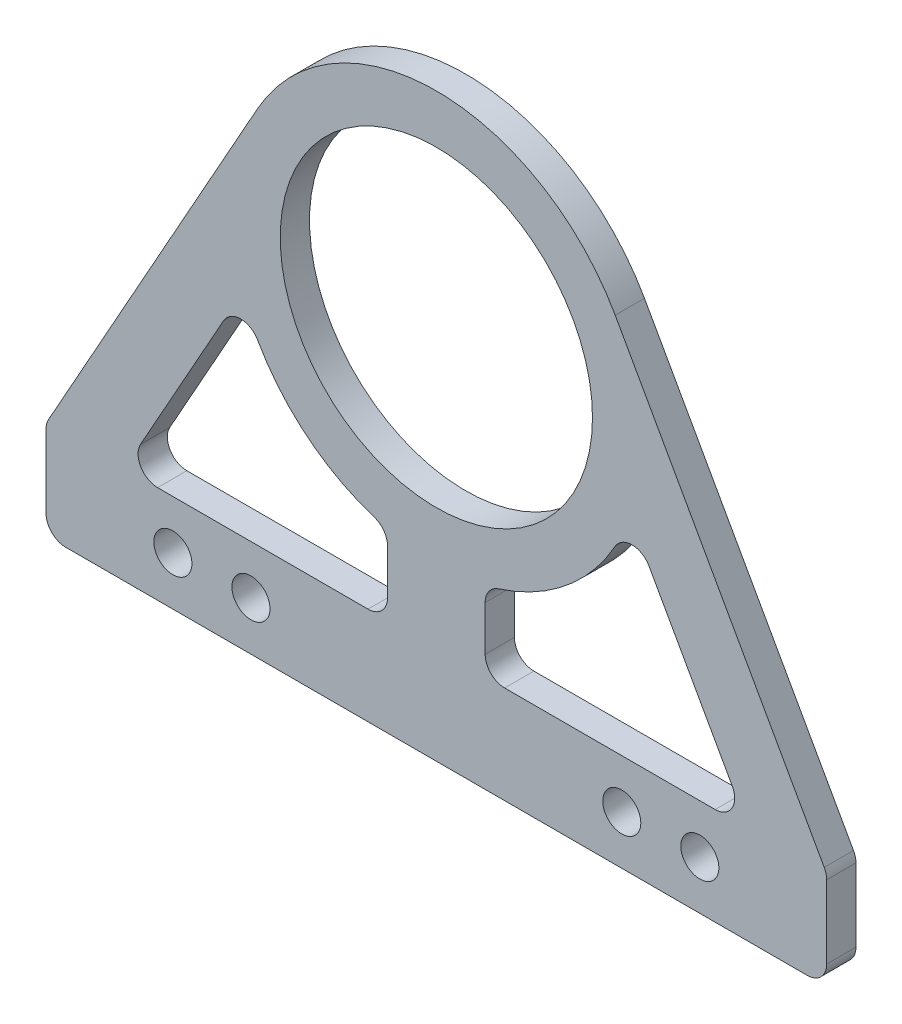
ISO-10303-21;
HEADER;
FILE_DESCRIPTION(('STEP AP214'),'2;1');
FILE_NAME('part.step','',(''),(''),'','','');
FILE_SCHEMA(('AUTOMOTIVE_DESIGN { 1 0 10303 214 1 1 1 1 }'));
ENDSEC;
DATA;
#1=APPLICATION_CONTEXT('core data for automotive mechanical design processes');
#2=APPLICATION_PROTOCOL_DEFINITION('international standard','automotive_design',2000,#1);
#3=PRODUCT_CONTEXT('',#1,'mechanical');
#4=PRODUCT('Part','Part','',(#3));
#5=PRODUCT_RELATED_PRODUCT_CATEGORY('part','',(#4));
#6=PRODUCT_DEFINITION_FORMATION('','',#4);
#7=PRODUCT_DEFINITION_CONTEXT('part definition',#1,'design');
#8=PRODUCT_DEFINITION('design','',#6,#7);
#9=PRODUCT_DEFINITION_SHAPE('','',#8);
#10=(LENGTH_UNIT() NAMED_UNIT(*) SI_UNIT(.MILLI.,.METRE.));
#11=(NAMED_UNIT(*) PLANE_ANGLE_UNIT() SI_UNIT($,.RADIAN.));
#12=(NAMED_UNIT(*) SI_UNIT($,.STERADIAN.) SOLID_ANGLE_UNIT());
#13=UNCERTAINTY_MEASURE_WITH_UNIT(LENGTH_MEASURE(1.E-05),#10,'distance_accuracy_value','');
#14=(GEOMETRIC_REPRESENTATION_CONTEXT(3) GLOBAL_UNCERTAINTY_ASSIGNED_CONTEXT((#13)) GLOBAL_UNIT_ASSIGNED_CONTEXT((#10,
#11,#12)) REPRESENTATION_CONTEXT('',''));
#15=CARTESIAN_POINT('',(0.,0.,0.));
#16=DIRECTION('',(0.,0.,1.));
#17=DIRECTION('',(1.,0.,0.));
#18=AXIS2_PLACEMENT_3D('',#15,#16,#17);
#19=CARTESIAN_POINT('',(0.,0.,3.));
#20=DIRECTION('',(0.,0.,1.));
#21=DIRECTION('',(1.,0.,0.));
#22=AXIS2_PLACEMENT_3D('',#19,#20,#21);
#23=PLANE('',#22);
#24=CARTESIAN_POINT('',(0.,0.,3.));
#25=DIRECTION('',(0.,0.,-1.));
#26=DIRECTION('',(-1.,0.,0.));
#27=AXIS2_PLACEMENT_3D('',#24,#25,#26);
#28=CIRCLE('',#27,21.);
#29=CARTESIAN_POINT('',(18.307282516346,-10.2880224954406,3.));
#30=VERTEX_POINT('',#29);
#31=CARTESIAN_POINT('',(6.39130434782609,-20.0037803610582,3.));
#32=VERTEX_POINT('',#31);
#33=EDGE_CURVE('E375',#30,#32,#28,.T.);
#34=ORIENTED_EDGE('',*,*,#33,.F.);
#35=CARTESIAN_POINT('',(20.0508332321885,-11.2678341616731,3.));
#36=DIRECTION('',(0.,0.,1.));
#37=DIRECTION('',(1.,0.,0.));
#38=AXIS2_PLACEMENT_3D('',#35,#36,#37);
#39=CIRCLE('',#38,2.);
#40=CARTESIAN_POINT('',(21.7963941777401,-10.2916082731796,3.));
#41=VERTEX_POINT('',#40);
#42=EDGE_CURVE('E352',#30,#41,#39,.F.);
#43=ORIENTED_EDGE('',*,*,#42,.T.);
#44=DIRECTION('',(-0.488112944246752,0.87278047277581,0.));
#45=VECTOR('',#44,1.);
#46=CARTESIAN_POINT('',(19.8591026870945,-6.82759404647329,3.));
#47=LINE('',#46,#45);
#48=CARTESIAN_POINT('',(30.3151655601406,-25.5237741115065,3.));
#49=VERTEX_POINT('',#48);
#50=EDGE_CURVE('E793',#49,#41,#47,.T.);
#51=ORIENTED_EDGE('',*,*,#50,.F.);
#52=CARTESIAN_POINT('',(28.569604614589,-26.5,3.));
#53=DIRECTION('',(0.,0.,1.));
#54=DIRECTION('',(1.,0.,0.));
#55=AXIS2_PLACEMENT_3D('',#52,#53,#54);
#56=CIRCLE('',#55,2.);
#57=CARTESIAN_POINT('',(28.569604614589,-28.5,3.));
#58=VERTEX_POINT('',#57);
#59=EDGE_CURVE('E340',#49,#58,#56,.F.);
#60=ORIENTED_EDGE('',*,*,#59,.T.);
#61=DIRECTION('',(1.,0.,0.));
#62=VECTOR('',#61,1.);
#63=CARTESIAN_POINT('',(31.9796555739417,-28.5,3.));
#64=LINE('',#63,#62);
#65=CARTESIAN_POINT('',(7.,-28.5,3.));
#66=VERTEX_POINT('',#65);
#67=EDGE_CURVE('E797',#66,#58,#64,.T.);
#68=ORIENTED_EDGE('',*,*,#67,.F.);
#69=CARTESIAN_POINT('',(7.,-26.5,3.));
#70=DIRECTION('',(0.,0.,1.));
#71=DIRECTION('',(1.,0.,0.));
#72=AXIS2_PLACEMENT_3D('',#69,#70,#71);
#73=CIRCLE('',#72,2.);
#74=CARTESIAN_POINT('',(5.,-26.5,3.));
#75=VERTEX_POINT('',#74);
#76=EDGE_CURVE('E344',#66,#75,#73,.F.);
#77=ORIENTED_EDGE('',*,*,#76,.T.);
#78=DIRECTION('',(0.,-1.,0.));
#79=VECTOR('',#78,1.);
#80=CARTESIAN_POINT('',(5.,-20.3960780543711,3.));
#81=LINE('',#80,#79);
#82=CARTESIAN_POINT('',(5.,-21.9089023002066,3.));
#83=VERTEX_POINT('',#82);
#84=EDGE_CURVE('E800',#83,#75,#81,.T.);
#85=ORIENTED_EDGE('',*,*,#84,.F.);
#86=CARTESIAN_POINT('',(7.,-21.9089023002066,3.));
#87=DIRECTION('',(0.,0.,1.));
#88=DIRECTION('',(1.,0.,0.));
#89=AXIS2_PLACEMENT_3D('',#86,#87,#88);
#90=CIRCLE('',#89,2.);
#91=EDGE_CURVE('E348',#83,#32,#90,.F.);
#92=ORIENTED_EDGE('',*,*,#91,.T.);
#93=EDGE_LOOP('',(#34,#43,#51,#60,#68,#77,#85,#92));
#94=FACE_BOUND('',#93,.T.);
#95=DIRECTION('',(-0.488112944246752,-0.872780472775811,0.));
#96=VECTOR('',#95,1.);
#97=CARTESIAN_POINT('',(-19.8591026870945,-6.82759404647329,3.));
#98=LINE('',#97,#96);
#99=CARTESIAN_POINT('',(-21.7963941777401,-10.2916082731796,3.));
#100=VERTEX_POINT('',#99);
#101=CARTESIAN_POINT('',(-30.3151655601406,-25.5237741115065,3.));
#102=VERTEX_POINT('',#101);
#103=EDGE_CURVE('E364',#100,#102,#98,.T.);
#104=ORIENTED_EDGE('',*,*,#103,.F.);
#105=CARTESIAN_POINT('',(-20.0508332321885,-11.2678341616731,3.));
#106=DIRECTION('',(0.,0.,1.));
#107=DIRECTION('',(1.,0.,0.));
#108=AXIS2_PLACEMENT_3D('',#105,#106,#107);
#109=CIRCLE('',#108,2.);
#110=CARTESIAN_POINT('',(-18.307282516346,-10.2880224954406,3.));
#111=VERTEX_POINT('',#110);
#112=EDGE_CURVE('E356',#100,#111,#109,.F.);
#113=ORIENTED_EDGE('',*,*,#112,.T.);
#114=CARTESIAN_POINT('',(0.,0.,3.));
#115=DIRECTION('',(0.,0.,-1.));
#116=DIRECTION('',(1.,0.,0.));
#117=AXIS2_PLACEMENT_3D('',#114,#115,#116);
#118=CIRCLE('',#117,21.);
#119=CARTESIAN_POINT('',(-6.39130434782608,-20.0037803610582,3.));
#120=VERTEX_POINT('',#119);
#121=EDGE_CURVE('E392',#120,#111,#118,.T.);
#122=ORIENTED_EDGE('',*,*,#121,.F.);
#123=CARTESIAN_POINT('',(-7.,-21.9089023002066,3.));
#124=DIRECTION('',(0.,0.,1.));
#125=DIRECTION('',(1.,0.,0.));
#126=AXIS2_PLACEMENT_3D('',#123,#124,#125);
#127=CIRCLE('',#126,2.);
#128=CARTESIAN_POINT('',(-5.,-21.9089023002066,3.));
#129=VERTEX_POINT('',#128);
#130=EDGE_CURVE('E332',#120,#129,#127,.F.);
#131=ORIENTED_EDGE('',*,*,#130,.T.);
#132=DIRECTION('',(0.,1.,0.));
#133=VECTOR('',#132,1.);
#134=CARTESIAN_POINT('',(-5.,-20.3960780543711,3.));
#135=LINE('',#134,#133);
#136=CARTESIAN_POINT('',(-5.,-26.5,3.));
#137=VERTEX_POINT('',#136);
#138=EDGE_CURVE('E788',#137,#129,#135,.T.);
#139=ORIENTED_EDGE('',*,*,#138,.F.);
#140=CARTESIAN_POINT('',(-7.,-26.5,3.));
#141=DIRECTION('',(0.,0.,1.));
#142=DIRECTION('',(1.,0.,0.));
#143=AXIS2_PLACEMENT_3D('',#140,#141,#142);
#144=CIRCLE('',#143,2.);
#145=CARTESIAN_POINT('',(-7.,-28.5,3.));
#146=VERTEX_POINT('',#145);
#147=EDGE_CURVE('E336',#137,#146,#144,.F.);
#148=ORIENTED_EDGE('',*,*,#147,.T.);
#149=DIRECTION('',(1.,0.,0.));
#150=VECTOR('',#149,1.);
#151=CARTESIAN_POINT('',(-31.9796555739417,-28.5,3.));
#152=LINE('',#151,#150);
#153=CARTESIAN_POINT('',(-28.569604614589,-28.5,3.));
#154=VERTEX_POINT('',#153);
#155=EDGE_CURVE('E366',#154,#146,#152,.T.);
#156=ORIENTED_EDGE('',*,*,#155,.F.);
#157=CARTESIAN_POINT('',(-28.569604614589,-26.5,3.));
#158=DIRECTION('',(0.,0.,1.));
#159=DIRECTION('',(1.,0.,0.));
#160=AXIS2_PLACEMENT_3D('',#157,#158,#159);
#161=CIRCLE('',#160,2.);
#162=EDGE_CURVE('E49',#154,#102,#161,.F.);
#163=ORIENTED_EDGE('',*,*,#162,.T.);
#164=EDGE_LOOP('',(#104,#113,#122,#131,#139,#148,#156,#163));
#165=FACE_BOUND('',#164,.T.);
#166=CARTESIAN_POINT('',(-27.,-33.5,3.));
#167=DIRECTION('',(0.,0.,1.));
#168=DIRECTION('',(1.,0.,0.));
#169=AXIS2_PLACEMENT_3D('',#166,#167,#168);
#170=CIRCLE('',#169,1.95);
#171=CARTESIAN_POINT('',(-25.05,-33.5,3.));
#172=VERTEX_POINT('',#171);
#173=EDGE_CURVE('E406',#172,#172,#170,.T.);
#174=ORIENTED_EDGE('',*,*,#173,.F.);
#175=EDGE_LOOP('',(#174));
#176=FACE_BOUND('',#175,.T.);
#177=CARTESIAN_POINT('',(27.,-33.5,3.));
#178=DIRECTION('',(0.,0.,1.));
#179=DIRECTION('',(1.,0.,0.));
#180=AXIS2_PLACEMENT_3D('',#177,#178,#179);
#181=CIRCLE('',#180,1.95);
#182=CARTESIAN_POINT('',(28.95,-33.5,3.));
#183=VERTEX_POINT('',#182);
#184=EDGE_CURVE('E418',#183,#183,#181,.T.);
#185=ORIENTED_EDGE('',*,*,#184,.F.);
#186=EDGE_LOOP('',(#185));
#187=FACE_BOUND('',#186,.T.);
#188=DIRECTION('',(0.,1.,0.));
#189=VECTOR('',#188,1.);
#190=CARTESIAN_POINT('',(40.,-38.5,3.));
#191=LINE('',#190,#189);
#192=CARTESIAN_POINT('',(40.,-36.5,3.));
#193=VERTEX_POINT('',#192);
#194=CARTESIAN_POINT('',(40.,-29.0212708604584,3.));
#195=VERTEX_POINT('',#194);
#196=EDGE_CURVE('E226',#193,#195,#191,.T.);
#197=ORIENTED_EDGE('',*,*,#196,.T.);
#198=CARTESIAN_POINT('',(38.,-29.0212708604584,3.));
#199=DIRECTION('',(0.,0.,1.));
#200=DIRECTION('',(1.,0.,0.));
#201=AXIS2_PLACEMENT_3D('',#198,#199,#200);
#202=CIRCLE('',#201,2.);
#203=CARTESIAN_POINT('',(39.7455609455516,-28.0450449719649,3.));
#204=VERTEX_POINT('',#203);
#205=EDGE_CURVE('E222',#195,#204,#202,.T.);
#206=ORIENTED_EDGE('',*,*,#205,.T.);
#207=DIRECTION('',(-0.488112944246752,0.872780472775811,0.));
#208=VECTOR('',#207,1.);
#209=CARTESIAN_POINT('',(40.,-28.5,3.));
#210=LINE('',#209,#208);
#211=CARTESIAN_POINT('',(18.328389928292,10.2503718291818,3.));
#212=VERTEX_POINT('',#211);
#213=EDGE_CURVE('E213',#204,#212,#210,.T.);
#214=ORIENTED_EDGE('',*,*,#213,.T.);
#215=CARTESIAN_POINT('',(0.,0.,3.));
#216=DIRECTION('',(0.,0.,1.));
#217=DIRECTION('',(1.,0.,0.));
#218=AXIS2_PLACEMENT_3D('',#215,#216,#217);
#219=CIRCLE('',#218,21.);
#220=CARTESIAN_POINT('',(-18.328389928292,10.2503718291818,3.));
#221=VERTEX_POINT('',#220);
#222=EDGE_CURVE('E219',#212,#221,#219,.T.);
#223=ORIENTED_EDGE('',*,*,#222,.T.);
#224=DIRECTION('',(-0.488112944246752,-0.872780472775811,0.));
#225=VECTOR('',#224,1.);
#226=CARTESIAN_POINT('',(-18.328389928292,10.2503718291818,3.));
#227=LINE('',#226,#225);
#228=CARTESIAN_POINT('',(-39.7455609455516,-28.0450449719649,3.));
#229=VERTEX_POINT('',#228);
#230=EDGE_CURVE('E259',#221,#229,#227,.T.);
#231=ORIENTED_EDGE('',*,*,#230,.T.);
#232=CARTESIAN_POINT('',(-38.,-29.0212708604584,3.));
#233=DIRECTION('',(0.,0.,1.));
#234=DIRECTION('',(1.,0.,0.));
#235=AXIS2_PLACEMENT_3D('',#232,#233,#234);
#236=CIRCLE('',#235,2.);
#237=CARTESIAN_POINT('',(-40.,-29.0212708604584,3.));
#238=VERTEX_POINT('',#237);
#239=EDGE_CURVE('E275',#229,#238,#236,.T.);
#240=ORIENTED_EDGE('',*,*,#239,.T.);
#241=DIRECTION('',(0.,-1.,0.));
#242=VECTOR('',#241,1.);
#243=CARTESIAN_POINT('',(-40.,-28.5,3.));
#244=LINE('',#243,#242);
#245=CARTESIAN_POINT('',(-40.,-36.5,3.));
#246=VERTEX_POINT('',#245);
#247=EDGE_CURVE('E429',#238,#246,#244,.T.);
#248=ORIENTED_EDGE('',*,*,#247,.T.);
#249=CARTESIAN_POINT('',(-38.,-36.5,3.));
#250=DIRECTION('',(0.,0.,1.));
#251=DIRECTION('',(1.,0.,0.));
#252=AXIS2_PLACEMENT_3D('',#249,#250,#251);
#253=CIRCLE('',#252,2.);
#254=CARTESIAN_POINT('',(-38.,-38.5,3.));
#255=VERTEX_POINT('',#254);
#256=EDGE_CURVE('E63',#246,#255,#253,.T.);
#257=ORIENTED_EDGE('',*,*,#256,.T.);
#258=DIRECTION('',(1.,0.,0.));
#259=VECTOR('',#258,1.);
#260=CARTESIAN_POINT('',(-40.,-38.5,3.));
#261=LINE('',#260,#259);
#262=CARTESIAN_POINT('',(38.,-38.5,3.));
#263=VERTEX_POINT('',#262);
#264=EDGE_CURVE('E431',#255,#263,#261,.T.);
#265=ORIENTED_EDGE('',*,*,#264,.T.);
#266=CARTESIAN_POINT('',(38.,-36.5,3.));
#267=DIRECTION('',(0.,0.,1.));
#268=DIRECTION('',(1.,0.,0.));
#269=AXIS2_PLACEMENT_3D('',#266,#267,#268);
#270=CIRCLE('',#269,2.);
#271=EDGE_CURVE('E278',#263,#193,#270,.T.);
#272=ORIENTED_EDGE('',*,*,#271,.T.);
#273=EDGE_LOOP('',(#197,#206,#214,#223,#231,#240,#248,#257,#265,#272));
#274=FACE_BOUND('',#273,.T.);
#275=CARTESIAN_POINT('',(0.,0.,3.));
#276=DIRECTION('',(0.,0.,1.));
#277=DIRECTION('',(1.,0.,0.));
#278=AXIS2_PLACEMENT_3D('',#275,#276,#277);
#279=CIRCLE('',#278,16.);
#280=CARTESIAN_POINT('',(16.,0.,3.));
#281=VERTEX_POINT('',#280);
#282=EDGE_CURVE('E249',#281,#281,#279,.T.);
#283=ORIENTED_EDGE('',*,*,#282,.F.);
#284=EDGE_LOOP('',(#283));
#285=FACE_BOUND('',#284,.T.);
#286=CARTESIAN_POINT('',(19.,-33.5,3.));
#287=DIRECTION('',(0.,0.,1.));
#288=DIRECTION('',(1.,0.,0.));
#289=AXIS2_PLACEMENT_3D('',#286,#287,#288);
#290=CIRCLE('',#289,1.95);
#291=CARTESIAN_POINT('',(20.95,-33.5,3.));
#292=VERTEX_POINT('',#291);
#293=EDGE_CURVE('E412',#292,#292,#290,.T.);
#294=ORIENTED_EDGE('',*,*,#293,.F.);
#295=EDGE_LOOP('',(#294));
#296=FACE_BOUND('',#295,.T.);
#297=CARTESIAN_POINT('',(-19.,-33.5,3.));
#298=DIRECTION('',(0.,0.,1.));
#299=DIRECTION('',(1.,0.,0.));
#300=AXIS2_PLACEMENT_3D('',#297,#298,#299);
#301=CIRCLE('',#300,1.95);
#302=CARTESIAN_POINT('',(-17.05,-33.5,3.));
#303=VERTEX_POINT('',#302);
#304=EDGE_CURVE('E398',#303,#303,#301,.T.);
#305=ORIENTED_EDGE('',*,*,#304,.F.);
#306=EDGE_LOOP('',(#305));
#307=FACE_BOUND('',#306,.T.);
#308=ADVANCED_FACE('F41',(#94,#165,#176,#187,#274,#285,#296,#307),#23,.T.);
#309=CARTESIAN_POINT('',(0.,0.,0.));
#310=DIRECTION('',(0.,0.,1.));
#311=DIRECTION('',(1.,0.,0.));
#312=AXIS2_PLACEMENT_3D('',#309,#310,#311);
#313=PLANE('',#312);
#314=DIRECTION('',(1.,0.,0.));
#315=VECTOR('',#314,1.);
#316=CARTESIAN_POINT('',(31.9796555739417,-28.5,0.));
#317=LINE('',#316,#315);
#318=CARTESIAN_POINT('',(7.,-28.5,0.));
#319=VERTEX_POINT('',#318);
#320=CARTESIAN_POINT('',(28.569604614589,-28.5,0.));
#321=VERTEX_POINT('',#320);
#322=EDGE_CURVE('E807',#319,#321,#317,.T.);
#323=ORIENTED_EDGE('',*,*,#322,.T.);
#324=CARTESIAN_POINT('',(28.569604614589,-26.5,0.));
#325=DIRECTION('',(0.,0.,1.));
#326=DIRECTION('',(1.,0.,0.));
#327=AXIS2_PLACEMENT_3D('',#324,#325,#326);
#328=CIRCLE('',#327,2.);
#329=CARTESIAN_POINT('',(30.3151655601406,-25.5237741115065,0.));
#330=VERTEX_POINT('',#329);
#331=EDGE_CURVE('E342',#321,#330,#328,.T.);
#332=ORIENTED_EDGE('',*,*,#331,.T.);
#333=DIRECTION('',(-0.488112944246752,0.87278047277581,0.));
#334=VECTOR('',#333,1.);
#335=CARTESIAN_POINT('',(19.8591026870945,-6.82759404647329,0.));
#336=LINE('',#335,#334);
#337=CARTESIAN_POINT('',(21.7963941777401,-10.2916082731796,0.));
#338=VERTEX_POINT('',#337);
#339=EDGE_CURVE('E405',#330,#338,#336,.T.);
#340=ORIENTED_EDGE('',*,*,#339,.T.);
#341=CARTESIAN_POINT('',(20.0508332321885,-11.2678341616731,0.));
#342=DIRECTION('',(0.,0.,1.));
#343=DIRECTION('',(1.,0.,0.));
#344=AXIS2_PLACEMENT_3D('',#341,#342,#343);
#345=CIRCLE('',#344,2.);
#346=CARTESIAN_POINT('',(18.307282516346,-10.2880224954406,0.));
#347=VERTEX_POINT('',#346);
#348=EDGE_CURVE('E354',#338,#347,#345,.T.);
#349=ORIENTED_EDGE('',*,*,#348,.T.);
#350=CARTESIAN_POINT('',(0.,0.,0.));
#351=DIRECTION('',(0.,0.,-1.));
#352=DIRECTION('',(-1.,0.,0.));
#353=AXIS2_PLACEMENT_3D('',#350,#351,#352);
#354=CIRCLE('',#353,21.);
#355=CARTESIAN_POINT('',(6.39130434782609,-20.0037803610582,0.));
#356=VERTEX_POINT('',#355);
#357=EDGE_CURVE('E796',#347,#356,#354,.T.);
#358=ORIENTED_EDGE('',*,*,#357,.T.);
#359=CARTESIAN_POINT('',(7.,-21.9089023002066,0.));
#360=DIRECTION('',(0.,0.,1.));
#361=DIRECTION('',(1.,0.,0.));
#362=AXIS2_PLACEMENT_3D('',#359,#360,#361);
#363=CIRCLE('',#362,2.);
#364=CARTESIAN_POINT('',(5.,-21.9089023002066,0.));
#365=VERTEX_POINT('',#364);
#366=EDGE_CURVE('E350',#356,#365,#363,.T.);
#367=ORIENTED_EDGE('',*,*,#366,.T.);
#368=DIRECTION('',(0.,-1.,0.));
#369=VECTOR('',#368,1.);
#370=CARTESIAN_POINT('',(5.,-20.3960780543711,0.));
#371=LINE('',#370,#369);
#372=CARTESIAN_POINT('',(5.,-26.5,0.));
#373=VERTEX_POINT('',#372);
#374=EDGE_CURVE('E810',#365,#373,#371,.T.);
#375=ORIENTED_EDGE('',*,*,#374,.T.);
#376=CARTESIAN_POINT('',(7.,-26.5,0.));
#377=DIRECTION('',(0.,0.,1.));
#378=DIRECTION('',(1.,0.,0.));
#379=AXIS2_PLACEMENT_3D('',#376,#377,#378);
#380=CIRCLE('',#379,2.);
#381=EDGE_CURVE('E346',#373,#319,#380,.T.);
#382=ORIENTED_EDGE('',*,*,#381,.T.);
#383=EDGE_LOOP('',(#323,#332,#340,#349,#358,#367,#375,#382));
#384=FACE_BOUND('',#383,.T.);
#385=DIRECTION('',(0.,1.,0.));
#386=VECTOR('',#385,1.);
#387=CARTESIAN_POINT('',(-5.,-20.3960780543711,0.));
#388=LINE('',#387,#386);
#389=CARTESIAN_POINT('',(-5.,-26.5,0.));
#390=VERTEX_POINT('',#389);
#391=CARTESIAN_POINT('',(-5.,-21.9089023002066,0.));
#392=VERTEX_POINT('',#391);
#393=EDGE_CURVE('E390',#390,#392,#388,.T.);
#394=ORIENTED_EDGE('',*,*,#393,.T.);
#395=CARTESIAN_POINT('',(-7.,-21.9089023002066,0.));
#396=DIRECTION('',(0.,0.,1.));
#397=DIRECTION('',(1.,0.,0.));
#398=AXIS2_PLACEMENT_3D('',#395,#396,#397);
#399=CIRCLE('',#398,2.);
#400=CARTESIAN_POINT('',(-6.39130434782608,-20.0037803610582,0.));
#401=VERTEX_POINT('',#400);
#402=EDGE_CURVE('E334',#392,#401,#399,.T.);
#403=ORIENTED_EDGE('',*,*,#402,.T.);
#404=CARTESIAN_POINT('',(0.,0.,0.));
#405=DIRECTION('',(0.,0.,-1.));
#406=DIRECTION('',(1.,0.,0.));
#407=AXIS2_PLACEMENT_3D('',#404,#405,#406);
#408=CIRCLE('',#407,21.);
#409=CARTESIAN_POINT('',(-18.307282516346,-10.2880224954406,0.));
#410=VERTEX_POINT('',#409);
#411=EDGE_CURVE('E394',#401,#410,#408,.T.);
#412=ORIENTED_EDGE('',*,*,#411,.T.);
#413=CARTESIAN_POINT('',(-20.0508332321885,-11.2678341616731,0.));
#414=DIRECTION('',(0.,0.,1.));
#415=DIRECTION('',(1.,0.,0.));
#416=AXIS2_PLACEMENT_3D('',#413,#414,#415);
#417=CIRCLE('',#416,2.);
#418=CARTESIAN_POINT('',(-21.7963941777401,-10.2916082731796,0.));
#419=VERTEX_POINT('',#418);
#420=EDGE_CURVE('E358',#410,#419,#417,.T.);
#421=ORIENTED_EDGE('',*,*,#420,.T.);
#422=DIRECTION('',(-0.488112944246752,-0.872780472775811,0.));
#423=VECTOR('',#422,1.);
#424=CARTESIAN_POINT('',(-19.8591026870945,-6.82759404647329,0.));
#425=LINE('',#424,#423);
#426=CARTESIAN_POINT('',(-30.3151655601406,-25.5237741115065,0.));
#427=VERTEX_POINT('',#426);
#428=EDGE_CURVE('E386',#419,#427,#425,.T.);
#429=ORIENTED_EDGE('',*,*,#428,.T.);
#430=CARTESIAN_POINT('',(-28.569604614589,-26.5,0.));
#431=DIRECTION('',(0.,0.,1.));
#432=DIRECTION('',(1.,0.,0.));
#433=AXIS2_PLACEMENT_3D('',#430,#431,#432);
#434=CIRCLE('',#433,2.);
#435=CARTESIAN_POINT('',(-28.569604614589,-28.5,0.));
#436=VERTEX_POINT('',#435);
#437=EDGE_CURVE('E11',#427,#436,#434,.T.);
#438=ORIENTED_EDGE('',*,*,#437,.T.);
#439=DIRECTION('',(1.,0.,0.));
#440=VECTOR('',#439,1.);
#441=CARTESIAN_POINT('',(-31.9796555739417,-28.5,0.));
#442=LINE('',#441,#440);
#443=CARTESIAN_POINT('',(-7.,-28.5,0.));
#444=VERTEX_POINT('',#443);
#445=EDGE_CURVE('E384',#436,#444,#442,.T.);
#446=ORIENTED_EDGE('',*,*,#445,.T.);
#447=CARTESIAN_POINT('',(-7.,-26.5,0.));
#448=DIRECTION('',(0.,0.,1.));
#449=DIRECTION('',(1.,0.,0.));
#450=AXIS2_PLACEMENT_3D('',#447,#448,#449);
#451=CIRCLE('',#450,2.);
#452=EDGE_CURVE('E338',#444,#390,#451,.T.);
#453=ORIENTED_EDGE('',*,*,#452,.T.);
#454=EDGE_LOOP('',(#394,#403,#412,#421,#429,#438,#446,#453));
#455=FACE_BOUND('',#454,.T.);
#456=DIRECTION('',(-0.488112944246752,0.872780472775811,0.));
#457=VECTOR('',#456,1.);
#458=CARTESIAN_POINT('',(40.,-28.5,0.));
#459=LINE('',#458,#457);
#460=CARTESIAN_POINT('',(39.7455609455516,-28.0450449719649,0.));
#461=VERTEX_POINT('',#460);
#462=CARTESIAN_POINT('',(18.328389928292,10.2503718291818,0.));
#463=VERTEX_POINT('',#462);
#464=EDGE_CURVE('E232',#461,#463,#459,.T.);
#465=ORIENTED_EDGE('',*,*,#464,.F.);
#466=CARTESIAN_POINT('',(38.,-29.0212708604584,0.));
#467=DIRECTION('',(0.,0.,1.));
#468=DIRECTION('',(1.,0.,0.));
#469=AXIS2_PLACEMENT_3D('',#466,#467,#468);
#470=CIRCLE('',#469,2.);
#471=CARTESIAN_POINT('',(40.,-29.0212708604584,0.));
#472=VERTEX_POINT('',#471);
#473=EDGE_CURVE('E268',#461,#472,#470,.F.);
#474=ORIENTED_EDGE('',*,*,#473,.T.);
#475=DIRECTION('',(0.,1.,0.));
#476=VECTOR('',#475,1.);
#477=CARTESIAN_POINT('',(40.,-38.5,0.));
#478=LINE('',#477,#476);
#479=CARTESIAN_POINT('',(40.,-36.5,0.));
#480=VERTEX_POINT('',#479);
#481=EDGE_CURVE('E254',#480,#472,#478,.T.);
#482=ORIENTED_EDGE('',*,*,#481,.F.);
#483=CARTESIAN_POINT('',(38.,-36.5,0.));
#484=DIRECTION('',(0.,0.,1.));
#485=DIRECTION('',(1.,0.,0.));
#486=AXIS2_PLACEMENT_3D('',#483,#484,#485);
#487=CIRCLE('',#486,2.);
#488=CARTESIAN_POINT('',(38.,-38.5,0.));
#489=VERTEX_POINT('',#488);
#490=EDGE_CURVE('E266',#480,#489,#487,.F.);
#491=ORIENTED_EDGE('',*,*,#490,.T.);
#492=DIRECTION('',(1.,0.,0.));
#493=VECTOR('',#492,1.);
#494=CARTESIAN_POINT('',(-40.,-38.5,0.));
#495=LINE('',#494,#493);
#496=CARTESIAN_POINT('',(-38.,-38.5,0.));
#497=VERTEX_POINT('',#496);
#498=EDGE_CURVE('E252',#497,#489,#495,.T.);
#499=ORIENTED_EDGE('',*,*,#498,.F.);
#500=CARTESIAN_POINT('',(-38.,-36.5,0.));
#501=DIRECTION('',(0.,0.,1.));
#502=DIRECTION('',(1.,0.,0.));
#503=AXIS2_PLACEMENT_3D('',#500,#501,#502);
#504=CIRCLE('',#503,2.);
#505=CARTESIAN_POINT('',(-40.,-36.5,0.));
#506=VERTEX_POINT('',#505);
#507=EDGE_CURVE('E264',#497,#506,#504,.F.);
#508=ORIENTED_EDGE('',*,*,#507,.T.);
#509=DIRECTION('',(0.,-1.,0.));
#510=VECTOR('',#509,1.);
#511=CARTESIAN_POINT('',(-40.,-28.5,0.));
#512=LINE('',#511,#510);
#513=CARTESIAN_POINT('',(-40.,-29.0212708604584,0.));
#514=VERTEX_POINT('',#513);
#515=EDGE_CURVE('E248',#514,#506,#512,.T.);
#516=ORIENTED_EDGE('',*,*,#515,.F.);
#517=CARTESIAN_POINT('',(-38.,-29.0212708604584,0.));
#518=DIRECTION('',(0.,0.,1.));
#519=DIRECTION('',(1.,0.,0.));
#520=AXIS2_PLACEMENT_3D('',#517,#518,#519);
#521=CIRCLE('',#520,2.);
#522=CARTESIAN_POINT('',(-39.7455609455516,-28.0450449719649,0.));
#523=VERTEX_POINT('',#522);
#524=EDGE_CURVE('E262',#514,#523,#521,.F.);
#525=ORIENTED_EDGE('',*,*,#524,.T.);
#526=DIRECTION('',(-0.488112944246752,-0.872780472775811,0.));
#527=VECTOR('',#526,1.);
#528=CARTESIAN_POINT('',(-18.328389928292,10.2503718291818,0.));
#529=LINE('',#528,#527);
#530=CARTESIAN_POINT('',(-18.328389928292,10.2503718291818,0.));
#531=VERTEX_POINT('',#530);
#532=EDGE_CURVE('E245',#531,#523,#529,.T.);
#533=ORIENTED_EDGE('',*,*,#532,.F.);
#534=CARTESIAN_POINT('',(0.,0.,0.));
#535=DIRECTION('',(0.,0.,1.));
#536=DIRECTION('',(1.,0.,0.));
#537=AXIS2_PLACEMENT_3D('',#534,#535,#536);
#538=CIRCLE('',#537,21.);
#539=EDGE_CURVE('E258',#463,#531,#538,.T.);
#540=ORIENTED_EDGE('',*,*,#539,.F.);
#541=EDGE_LOOP('',(#465,#474,#482,#491,#499,#508,#516,#525,#533,#540));
#542=FACE_BOUND('',#541,.T.);
#543=CARTESIAN_POINT('',(0.,0.,0.));
#544=DIRECTION('',(0.,0.,1.));
#545=DIRECTION('',(1.,0.,0.));
#546=AXIS2_PLACEMENT_3D('',#543,#544,#545);
#547=CIRCLE('',#546,16.);
#548=CARTESIAN_POINT('',(16.,0.,0.));
#549=VERTEX_POINT('',#548);
#550=EDGE_CURVE('E421',#549,#549,#547,.T.);
#551=ORIENTED_EDGE('',*,*,#550,.T.);
#552=EDGE_LOOP('',(#551));
#553=FACE_BOUND('',#552,.T.);
#554=CARTESIAN_POINT('',(27.,-33.5,0.));
#555=DIRECTION('',(0.,0.,1.));
#556=DIRECTION('',(1.,0.,0.));
#557=AXIS2_PLACEMENT_3D('',#554,#555,#556);
#558=CIRCLE('',#557,1.95);
#559=CARTESIAN_POINT('',(28.95,-33.5,0.));
#560=VERTEX_POINT('',#559);
#561=EDGE_CURVE('E415',#560,#560,#558,.T.);
#562=ORIENTED_EDGE('',*,*,#561,.T.);
#563=EDGE_LOOP('',(#562));
#564=FACE_BOUND('',#563,.T.);
#565=CARTESIAN_POINT('',(19.,-33.5,0.));
#566=DIRECTION('',(0.,0.,1.));
#567=DIRECTION('',(1.,0.,0.));
#568=AXIS2_PLACEMENT_3D('',#565,#566,#567);
#569=CIRCLE('',#568,1.95);
#570=CARTESIAN_POINT('',(20.95,-33.5,0.));
#571=VERTEX_POINT('',#570);
#572=EDGE_CURVE('E409',#571,#571,#569,.T.);
#573=ORIENTED_EDGE('',*,*,#572,.T.);
#574=EDGE_LOOP('',(#573));
#575=FACE_BOUND('',#574,.T.);
#576=CARTESIAN_POINT('',(-27.,-33.5,0.));
#577=DIRECTION('',(0.,0.,1.));
#578=DIRECTION('',(1.,0.,0.));
#579=AXIS2_PLACEMENT_3D('',#576,#577,#578);
#580=CIRCLE('',#579,1.95);
#581=CARTESIAN_POINT('',(-25.05,-33.5,0.));
#582=VERTEX_POINT('',#581);
#583=EDGE_CURVE('E401',#582,#582,#580,.T.);
#584=ORIENTED_EDGE('',*,*,#583,.T.);
#585=EDGE_LOOP('',(#584));
#586=FACE_BOUND('',#585,.T.);
#587=CARTESIAN_POINT('',(-19.,-33.5,0.));
#588=DIRECTION('',(0.,0.,1.));
#589=DIRECTION('',(1.,0.,0.));
#590=AXIS2_PLACEMENT_3D('',#587,#588,#589);
#591=CIRCLE('',#590,1.95);
#592=CARTESIAN_POINT('',(-17.05,-33.5,0.));
#593=VERTEX_POINT('',#592);
#594=EDGE_CURVE('E402',#593,#593,#591,.T.);
#595=ORIENTED_EDGE('',*,*,#594,.T.);
#596=EDGE_LOOP('',(#595));
#597=FACE_BOUND('',#596,.T.);
#598=ADVANCED_FACE('F382',(#384,#455,#542,#553,#564,#575,#586,#597),#313,.F.);
#599=CARTESIAN_POINT('',(-18.328389928292,10.2503718291818,3.));
#600=DIRECTION('',(0.87278047277581,-0.488112944246752,0.));
#601=DIRECTION('',(0.488112944246752,0.872780472775811,0.));
#602=AXIS2_PLACEMENT_3D('',#599,#600,#601);
#603=PLANE('',#602);
#604=ORIENTED_EDGE('',*,*,#532,.T.);
#605=DIRECTION('',(0.,0.,-1.));
#606=VECTOR('',#605,1.);
#607=CARTESIAN_POINT('',(-39.7455609455516,-28.0450449719649,3.));
#608=LINE('',#607,#606);
#609=EDGE_CURVE('E290',#523,#229,#608,.F.);
#610=ORIENTED_EDGE('',*,*,#609,.T.);
#611=ORIENTED_EDGE('',*,*,#230,.F.);
#612=DIRECTION('',(0.,0.,-1.));
#613=VECTOR('',#612,1.);
#614=CARTESIAN_POINT('',(-18.328389928292,10.2503718291818,3.));
#615=LINE('',#614,#613);
#616=EDGE_CURVE('E236',#221,#531,#615,.T.);
#617=ORIENTED_EDGE('',*,*,#616,.T.);
#618=EDGE_LOOP('',(#604,#610,#611,#617));
#619=FACE_BOUND('',#618,.T.);
#620=ADVANCED_FACE('F443',(#619),#603,.F.);
#621=CARTESIAN_POINT('',(-40.,-28.5,3.));
#622=DIRECTION('',(1.,0.,0.));
#623=DIRECTION('',(0.,0.,-1.));
#624=AXIS2_PLACEMENT_3D('',#621,#622,#623);
#625=PLANE('',#624);
#626=ORIENTED_EDGE('',*,*,#515,.T.);
#627=DIRECTION('',(0.,0.,-1.));
#628=VECTOR('',#627,1.);
#629=CARTESIAN_POINT('',(-40.,-36.5,3.));
#630=LINE('',#629,#628);
#631=EDGE_CURVE('E288',#506,#246,#630,.F.);
#632=ORIENTED_EDGE('',*,*,#631,.T.);
#633=ORIENTED_EDGE('',*,*,#247,.F.);
#634=DIRECTION('',(0.,0.,-1.));
#635=VECTOR('',#634,1.);
#636=CARTESIAN_POINT('',(-40.,-29.0212708604584,3.));
#637=LINE('',#636,#635);
#638=EDGE_CURVE('E285',#238,#514,#637,.T.);
#639=ORIENTED_EDGE('',*,*,#638,.T.);
#640=EDGE_LOOP('',(#626,#632,#633,#639));
#641=FACE_BOUND('',#640,.T.);
#642=ADVANCED_FACE('F452',(#641),#625,.F.);
#643=CARTESIAN_POINT('',(-40.,-38.5,3.));
#644=DIRECTION('',(0.,1.,0.));
#645=DIRECTION('',(0.,0.,1.));
#646=AXIS2_PLACEMENT_3D('',#643,#644,#645);
#647=PLANE('',#646);
#648=ORIENTED_EDGE('',*,*,#498,.T.);
#649=DIRECTION('',(0.,0.,-1.));
#650=VECTOR('',#649,1.);
#651=CARTESIAN_POINT('',(38.,-38.5,3.));
#652=LINE('',#651,#650);
#653=EDGE_CURVE('E56',#489,#263,#652,.F.);
#654=ORIENTED_EDGE('',*,*,#653,.T.);
#655=ORIENTED_EDGE('',*,*,#264,.F.);
#656=DIRECTION('',(0.,0.,-1.));
#657=VECTOR('',#656,1.);
#658=CARTESIAN_POINT('',(-38.,-38.5,3.));
#659=LINE('',#658,#657);
#660=EDGE_CURVE('E281',#255,#497,#659,.T.);
#661=ORIENTED_EDGE('',*,*,#660,.T.);
#662=EDGE_LOOP('',(#648,#654,#655,#661));
#663=FACE_BOUND('',#662,.T.);
#664=ADVANCED_FACE('F458',(#663),#647,.F.);
#665=CARTESIAN_POINT('',(40.,-38.5,3.));
#666=DIRECTION('',(-1.,0.,0.));
#667=DIRECTION('',(0.,0.,1.));
#668=AXIS2_PLACEMENT_3D('',#665,#666,#667);
#669=PLANE('',#668);
#670=ORIENTED_EDGE('',*,*,#481,.T.);
#671=DIRECTION('',(0.,0.,-1.));
#672=VECTOR('',#671,1.);
#673=CARTESIAN_POINT('',(40.,-29.0212708604584,3.));
#674=LINE('',#673,#672);
#675=EDGE_CURVE('E273',#472,#195,#674,.F.);
#676=ORIENTED_EDGE('',*,*,#675,.T.);
#677=ORIENTED_EDGE('',*,*,#196,.F.);
#678=DIRECTION('',(0.,0.,-1.));
#679=VECTOR('',#678,1.);
#680=CARTESIAN_POINT('',(40.,-36.5,3.));
#681=LINE('',#680,#679);
#682=EDGE_CURVE('E270',#193,#480,#681,.T.);
#683=ORIENTED_EDGE('',*,*,#682,.T.);
#684=EDGE_LOOP('',(#670,#676,#677,#683));
#685=FACE_BOUND('',#684,.T.);
#686=ADVANCED_FACE('F461',(#685),#669,.F.);
#687=CARTESIAN_POINT('',(40.,-28.5,3.));
#688=DIRECTION('',(-0.87278047277581,-0.488112944246752,0.));
#689=DIRECTION('',(0.488112944246752,-0.872780472775811,0.));
#690=AXIS2_PLACEMENT_3D('',#687,#688,#689);
#691=PLANE('',#690);
#692=ORIENTED_EDGE('',*,*,#213,.F.);
#693=DIRECTION('',(0.,0.,-1.));
#694=VECTOR('',#693,1.);
#695=CARTESIAN_POINT('',(39.7455609455516,-28.0450449719649,3.));
#696=LINE('',#695,#694);
#697=EDGE_CURVE('E235',#204,#461,#696,.T.);
#698=ORIENTED_EDGE('',*,*,#697,.T.);
#699=ORIENTED_EDGE('',*,*,#464,.T.);
#700=DIRECTION('',(0.,0.,-1.));
#701=VECTOR('',#700,1.);
#702=CARTESIAN_POINT('',(18.328389928292,10.2503718291818,3.));
#703=LINE('',#702,#701);
#704=EDGE_CURVE('E229',#212,#463,#703,.T.);
#705=ORIENTED_EDGE('',*,*,#704,.F.);
#706=EDGE_LOOP('',(#692,#698,#699,#705));
#707=FACE_BOUND('',#706,.T.);
#708=ADVANCED_FACE('F230',(#707),#691,.F.);
#709=CARTESIAN_POINT('',(0.,0.,3.));
#710=DIRECTION('',(0.,0.,-1.));
#711=DIRECTION('',(-1.,0.,0.));
#712=AXIS2_PLACEMENT_3D('',#709,#710,#711);
#713=CYLINDRICAL_SURFACE('',#712,21.);
#714=ORIENTED_EDGE('',*,*,#539,.T.);
#715=ORIENTED_EDGE('',*,*,#616,.F.);
#716=ORIENTED_EDGE('',*,*,#222,.F.);
#717=ORIENTED_EDGE('',*,*,#704,.T.);
#718=EDGE_LOOP('',(#714,#715,#716,#717));
#719=FACE_BOUND('',#718,.T.);
#720=ADVANCED_FACE('F238',(#719),#713,.T.);
#721=CARTESIAN_POINT('',(0.,0.,3.));
#722=DIRECTION('',(0.,0.,-1.));
#723=DIRECTION('',(-1.,0.,0.));
#724=AXIS2_PLACEMENT_3D('',#721,#722,#723);
#725=CYLINDRICAL_SURFACE('',#724,16.);
#726=ORIENTED_EDGE('',*,*,#282,.T.);
#727=EDGE_LOOP('',(#726));
#728=FACE_BOUND('',#727,.T.);
#729=ORIENTED_EDGE('',*,*,#550,.F.);
#730=EDGE_LOOP('',(#729));
#731=FACE_BOUND('',#730,.T.);
#732=ADVANCED_FACE('F481',(#728,#731),#725,.F.);
#733=CARTESIAN_POINT('',(27.,-33.5,3.));
#734=DIRECTION('',(0.,0.,-1.));
#735=DIRECTION('',(-1.,0.,0.));
#736=AXIS2_PLACEMENT_3D('',#733,#734,#735);
#737=CYLINDRICAL_SURFACE('',#736,1.95);
#738=ORIENTED_EDGE('',*,*,#184,.T.);
#739=EDGE_LOOP('',(#738));
#740=FACE_BOUND('',#739,.T.);
#741=ORIENTED_EDGE('',*,*,#561,.F.);
#742=EDGE_LOOP('',(#741));
#743=FACE_BOUND('',#742,.T.);
#744=ADVANCED_FACE('F488',(#740,#743),#737,.F.);
#745=CARTESIAN_POINT('',(19.,-33.5,3.));
#746=DIRECTION('',(0.,0.,-1.));
#747=DIRECTION('',(-1.,0.,0.));
#748=AXIS2_PLACEMENT_3D('',#745,#746,#747);
#749=CYLINDRICAL_SURFACE('',#748,1.95);
#750=ORIENTED_EDGE('',*,*,#293,.T.);
#751=EDGE_LOOP('',(#750));
#752=FACE_BOUND('',#751,.T.);
#753=ORIENTED_EDGE('',*,*,#572,.F.);
#754=EDGE_LOOP('',(#753));
#755=FACE_BOUND('',#754,.T.);
#756=ADVANCED_FACE('F493',(#752,#755),#749,.F.);
#757=CARTESIAN_POINT('',(-27.,-33.5,3.));
#758=DIRECTION('',(0.,0.,-1.));
#759=DIRECTION('',(-1.,0.,0.));
#760=AXIS2_PLACEMENT_3D('',#757,#758,#759);
#761=CYLINDRICAL_SURFACE('',#760,1.95);
#762=ORIENTED_EDGE('',*,*,#173,.T.);
#763=EDGE_LOOP('',(#762));
#764=FACE_BOUND('',#763,.T.);
#765=ORIENTED_EDGE('',*,*,#583,.F.);
#766=EDGE_LOOP('',(#765));
#767=FACE_BOUND('',#766,.T.);
#768=ADVANCED_FACE('F508',(#764,#767),#761,.F.);
#769=CARTESIAN_POINT('',(-19.,-33.5,3.));
#770=DIRECTION('',(0.,0.,-1.));
#771=DIRECTION('',(-1.,0.,0.));
#772=AXIS2_PLACEMENT_3D('',#769,#770,#771);
#773=CYLINDRICAL_SURFACE('',#772,1.95);
#774=ORIENTED_EDGE('',*,*,#304,.T.);
#775=EDGE_LOOP('',(#774));
#776=FACE_BOUND('',#775,.T.);
#777=ORIENTED_EDGE('',*,*,#594,.F.);
#778=EDGE_LOOP('',(#777));
#779=FACE_BOUND('',#778,.T.);
#780=ADVANCED_FACE('F507',(#776,#779),#773,.F.);
#781=CARTESIAN_POINT('',(-19.8591026870945,-6.82759404647329,0.));
#782=DIRECTION('',(-0.872780472775811,0.488112944246752,0.));
#783=DIRECTION('',(-0.488112944246752,-0.872780472775811,0.));
#784=AXIS2_PLACEMENT_3D('',#781,#782,#783);
#785=PLANE('',#784);
#786=ORIENTED_EDGE('',*,*,#428,.F.);
#787=DIRECTION('',(0.,0.,-1.));
#788=VECTOR('',#787,1.);
#789=CARTESIAN_POINT('',(-21.7963941777401,-10.2916082731796,3.));
#790=LINE('',#789,#788);
#791=EDGE_CURVE('E329',#419,#100,#790,.F.);
#792=ORIENTED_EDGE('',*,*,#791,.T.);
#793=ORIENTED_EDGE('',*,*,#103,.T.);
#794=DIRECTION('',(0.,0.,1.));
#795=VECTOR('',#794,1.);
#796=CARTESIAN_POINT('',(-30.3151655601406,-25.5237741115065,0.));
#797=LINE('',#796,#795);
#798=EDGE_CURVE('E327',#102,#427,#797,.F.);
#799=ORIENTED_EDGE('',*,*,#798,.T.);
#800=EDGE_LOOP('',(#786,#792,#793,#799));
#801=FACE_BOUND('',#800,.T.);
#802=ADVANCED_FACE('F372',(#801),#785,.F.);
#803=CARTESIAN_POINT('',(0.,0.,0.));
#804=DIRECTION('',(0.,0.,1.));
#805=DIRECTION('',(1.,0.,0.));
#806=AXIS2_PLACEMENT_3D('',#803,#804,#805);
#807=CYLINDRICAL_SURFACE('',#806,21.);
#808=ORIENTED_EDGE('',*,*,#411,.F.);
#809=DIRECTION('',(0.,0.,1.));
#810=VECTOR('',#809,1.);
#811=CARTESIAN_POINT('',(-6.39130434782608,-20.0037803610582,0.));
#812=LINE('',#811,#810);
#813=EDGE_CURVE('E294',#401,#120,#812,.T.);
#814=ORIENTED_EDGE('',*,*,#813,.T.);
#815=ORIENTED_EDGE('',*,*,#121,.T.);
#816=DIRECTION('',(0.,0.,1.));
#817=VECTOR('',#816,1.);
#818=CARTESIAN_POINT('',(-18.307282516346,-10.2880224954406,0.));
#819=LINE('',#818,#817);
#820=EDGE_CURVE('E292',#111,#410,#819,.F.);
#821=ORIENTED_EDGE('',*,*,#820,.T.);
#822=EDGE_LOOP('',(#808,#814,#815,#821));
#823=FACE_BOUND('',#822,.T.);
#824=ADVANCED_FACE('F515',(#823),#807,.T.);
#825=CARTESIAN_POINT('',(-5.,-20.3960780543711,0.));
#826=DIRECTION('',(1.,0.,0.));
#827=DIRECTION('',(0.,1.,0.));
#828=AXIS2_PLACEMENT_3D('',#825,#826,#827);
#829=PLANE('',#828);
#830=ORIENTED_EDGE('',*,*,#138,.T.);
#831=DIRECTION('',(0.,0.,-1.));
#832=VECTOR('',#831,1.);
#833=CARTESIAN_POINT('',(-5.,-21.9089023002066,0.));
#834=LINE('',#833,#832);
#835=EDGE_CURVE('E300',#129,#392,#834,.T.);
#836=ORIENTED_EDGE('',*,*,#835,.T.);
#837=ORIENTED_EDGE('',*,*,#393,.F.);
#838=DIRECTION('',(0.,0.,1.));
#839=VECTOR('',#838,1.);
#840=CARTESIAN_POINT('',(-5.,-26.5,3.));
#841=LINE('',#840,#839);
#842=EDGE_CURVE('E297',#390,#137,#841,.T.);
#843=ORIENTED_EDGE('',*,*,#842,.T.);
#844=EDGE_LOOP('',(#830,#836,#837,#843));
#845=FACE_BOUND('',#844,.T.);
#846=ADVANCED_FACE('F558',(#845),#829,.F.);
#847=CARTESIAN_POINT('',(-31.9796555739417,-28.5,0.));
#848=DIRECTION('',(0.,-1.,0.));
#849=DIRECTION('',(0.,0.,-1.));
#850=AXIS2_PLACEMENT_3D('',#847,#848,#849);
#851=PLANE('',#850);
#852=ORIENTED_EDGE('',*,*,#155,.T.);
#853=DIRECTION('',(0.,0.,1.));
#854=VECTOR('',#853,1.);
#855=CARTESIAN_POINT('',(-7.,-28.5,0.));
#856=LINE('',#855,#854);
#857=EDGE_CURVE('E305',#146,#444,#856,.F.);
#858=ORIENTED_EDGE('',*,*,#857,.T.);
#859=ORIENTED_EDGE('',*,*,#445,.F.);
#860=DIRECTION('',(0.,0.,1.));
#861=VECTOR('',#860,1.);
#862=CARTESIAN_POINT('',(-28.569604614589,-28.5,3.));
#863=LINE('',#862,#861);
#864=EDGE_CURVE('E302',#436,#154,#863,.T.);
#865=ORIENTED_EDGE('',*,*,#864,.T.);
#866=EDGE_LOOP('',(#852,#858,#859,#865));
#867=FACE_BOUND('',#866,.T.);
#868=ADVANCED_FACE('F388',(#867),#851,.F.);
#869=CARTESIAN_POINT('',(0.,0.,0.));
#870=DIRECTION('',(0.,0.,1.));
#871=DIRECTION('',(1.,0.,0.));
#872=AXIS2_PLACEMENT_3D('',#869,#870,#871);
#873=CYLINDRICAL_SURFACE('',#872,21.);
#874=ORIENTED_EDGE('',*,*,#33,.T.);
#875=DIRECTION('',(0.,0.,1.));
#876=VECTOR('',#875,1.);
#877=CARTESIAN_POINT('',(6.39130434782609,-20.0037803610582,0.));
#878=LINE('',#877,#876);
#879=EDGE_CURVE('E325',#32,#356,#878,.F.);
#880=ORIENTED_EDGE('',*,*,#879,.T.);
#881=ORIENTED_EDGE('',*,*,#357,.F.);
#882=DIRECTION('',(0.,0.,1.));
#883=VECTOR('',#882,1.);
#884=CARTESIAN_POINT('',(18.307282516346,-10.2880224954406,0.));
#885=LINE('',#884,#883);
#886=EDGE_CURVE('E322',#347,#30,#885,.T.);
#887=ORIENTED_EDGE('',*,*,#886,.T.);
#888=EDGE_LOOP('',(#874,#880,#881,#887));
#889=FACE_BOUND('',#888,.T.);
#890=ADVANCED_FACE('F575',(#889),#873,.T.);
#891=CARTESIAN_POINT('',(19.8591026870945,-6.82759404647329,0.));
#892=DIRECTION('',(0.87278047277581,0.488112944246752,0.));
#893=DIRECTION('',(-0.488112944246752,0.872780472775811,0.));
#894=AXIS2_PLACEMENT_3D('',#891,#892,#893);
#895=PLANE('',#894);
#896=ORIENTED_EDGE('',*,*,#339,.F.);
#897=DIRECTION('',(0.,0.,1.));
#898=VECTOR('',#897,1.);
#899=CARTESIAN_POINT('',(30.3151655601406,-25.5237741115065,3.));
#900=LINE('',#899,#898);
#901=EDGE_CURVE('E309',#330,#49,#900,.T.);
#902=ORIENTED_EDGE('',*,*,#901,.T.);
#903=ORIENTED_EDGE('',*,*,#50,.T.);
#904=DIRECTION('',(0.,0.,-1.));
#905=VECTOR('',#904,1.);
#906=CARTESIAN_POINT('',(21.7963941777401,-10.2916082731796,0.));
#907=LINE('',#906,#905);
#908=EDGE_CURVE('E307',#41,#338,#907,.T.);
#909=ORIENTED_EDGE('',*,*,#908,.T.);
#910=EDGE_LOOP('',(#896,#902,#903,#909));
#911=FACE_BOUND('',#910,.T.);
#912=ADVANCED_FACE('F584',(#911),#895,.F.);
#913=CARTESIAN_POINT('',(31.9796555739417,-28.5,0.));
#914=DIRECTION('',(0.,-1.,0.));
#915=DIRECTION('',(1.,0.,0.));
#916=AXIS2_PLACEMENT_3D('',#913,#914,#915);
#917=PLANE('',#916);
#918=ORIENTED_EDGE('',*,*,#67,.T.);
#919=DIRECTION('',(0.,0.,1.));
#920=VECTOR('',#919,1.);
#921=CARTESIAN_POINT('',(28.569604614589,-28.5,0.));
#922=LINE('',#921,#920);
#923=EDGE_CURVE('E315',#58,#321,#922,.F.);
#924=ORIENTED_EDGE('',*,*,#923,.T.);
#925=ORIENTED_EDGE('',*,*,#322,.F.);
#926=DIRECTION('',(0.,0.,1.));
#927=VECTOR('',#926,1.);
#928=CARTESIAN_POINT('',(7.,-28.5,3.));
#929=LINE('',#928,#927);
#930=EDGE_CURVE('E312',#319,#66,#929,.T.);
#931=ORIENTED_EDGE('',*,*,#930,.T.);
#932=EDGE_LOOP('',(#918,#924,#925,#931));
#933=FACE_BOUND('',#932,.T.);
#934=ADVANCED_FACE('F594',(#933),#917,.F.);
#935=CARTESIAN_POINT('',(5.,-20.3960780543711,0.));
#936=DIRECTION('',(-1.,0.,0.));
#937=DIRECTION('',(0.,-1.,0.));
#938=AXIS2_PLACEMENT_3D('',#935,#936,#937);
#939=PLANE('',#938);
#940=ORIENTED_EDGE('',*,*,#84,.T.);
#941=DIRECTION('',(0.,0.,1.));
#942=VECTOR('',#941,1.);
#943=CARTESIAN_POINT('',(5.,-26.5,0.));
#944=LINE('',#943,#942);
#945=EDGE_CURVE('E320',#75,#373,#944,.F.);
#946=ORIENTED_EDGE('',*,*,#945,.T.);
#947=ORIENTED_EDGE('',*,*,#374,.F.);
#948=DIRECTION('',(0.,0.,-1.));
#949=VECTOR('',#948,1.);
#950=CARTESIAN_POINT('',(5.,-21.9089023002066,3.));
#951=LINE('',#950,#949);
#952=EDGE_CURVE('E317',#365,#83,#951,.F.);
#953=ORIENTED_EDGE('',*,*,#952,.T.);
#954=EDGE_LOOP('',(#940,#946,#947,#953));
#955=FACE_BOUND('',#954,.T.);
#956=ADVANCED_FACE('F604',(#955),#939,.F.);
#957=CARTESIAN_POINT('',(38.,-29.0212708604584,3.));
#958=DIRECTION('',(0.,0.,-1.));
#959=DIRECTION('',(-1.,0.,0.));
#960=AXIS2_PLACEMENT_3D('',#957,#958,#959);
#961=CYLINDRICAL_SURFACE('',#960,2.);
#962=ORIENTED_EDGE('',*,*,#205,.F.);
#963=ORIENTED_EDGE('',*,*,#675,.F.);
#964=ORIENTED_EDGE('',*,*,#473,.F.);
#965=ORIENTED_EDGE('',*,*,#697,.F.);
#966=EDGE_LOOP('',(#962,#963,#964,#965));
#967=FACE_BOUND('',#966,.T.);
#968=ADVANCED_FACE('F438',(#967),#961,.T.);
#969=CARTESIAN_POINT('',(38.,-36.5,3.));
#970=DIRECTION('',(0.,0.,-1.));
#971=DIRECTION('',(-1.,0.,0.));
#972=AXIS2_PLACEMENT_3D('',#969,#970,#971);
#973=CYLINDRICAL_SURFACE('',#972,2.);
#974=ORIENTED_EDGE('',*,*,#271,.F.);
#975=ORIENTED_EDGE('',*,*,#653,.F.);
#976=ORIENTED_EDGE('',*,*,#490,.F.);
#977=ORIENTED_EDGE('',*,*,#682,.F.);
#978=EDGE_LOOP('',(#974,#975,#976,#977));
#979=FACE_BOUND('',#978,.T.);
#980=ADVANCED_FACE('F460',(#979),#973,.T.);
#981=CARTESIAN_POINT('',(-38.,-36.5,3.));
#982=DIRECTION('',(0.,0.,-1.));
#983=DIRECTION('',(-1.,0.,0.));
#984=AXIS2_PLACEMENT_3D('',#981,#982,#983);
#985=CYLINDRICAL_SURFACE('',#984,2.);
#986=ORIENTED_EDGE('',*,*,#256,.F.);
#987=ORIENTED_EDGE('',*,*,#631,.F.);
#988=ORIENTED_EDGE('',*,*,#507,.F.);
#989=ORIENTED_EDGE('',*,*,#660,.F.);
#990=EDGE_LOOP('',(#986,#987,#988,#989));
#991=FACE_BOUND('',#990,.T.);
#992=ADVANCED_FACE('F457',(#991),#985,.T.);
#993=CARTESIAN_POINT('',(-38.,-29.0212708604584,3.));
#994=DIRECTION('',(0.,0.,-1.));
#995=DIRECTION('',(-1.,0.,0.));
#996=AXIS2_PLACEMENT_3D('',#993,#994,#995);
#997=CYLINDRICAL_SURFACE('',#996,2.);
#998=ORIENTED_EDGE('',*,*,#239,.F.);
#999=ORIENTED_EDGE('',*,*,#609,.F.);
#1000=ORIENTED_EDGE('',*,*,#524,.F.);
#1001=ORIENTED_EDGE('',*,*,#638,.F.);
#1002=EDGE_LOOP('',(#998,#999,#1000,#1001));
#1003=FACE_BOUND('',#1002,.T.);
#1004=ADVANCED_FACE('F449',(#1003),#997,.T.);
#1005=CARTESIAN_POINT('',(-7.,-21.9089023002066,0.));
#1006=DIRECTION('',(0.,0.,1.));
#1007=DIRECTION('',(1.,0.,0.));
#1008=AXIS2_PLACEMENT_3D('',#1005,#1006,#1007);
#1009=CYLINDRICAL_SURFACE('',#1008,2.);
#1010=ORIENTED_EDGE('',*,*,#402,.F.);
#1011=ORIENTED_EDGE('',*,*,#835,.F.);
#1012=ORIENTED_EDGE('',*,*,#130,.F.);
#1013=ORIENTED_EDGE('',*,*,#813,.F.);
#1014=EDGE_LOOP('',(#1010,#1011,#1012,#1013));
#1015=FACE_BOUND('',#1014,.T.);
#1016=ADVANCED_FACE('F647',(#1015),#1009,.F.);
#1017=CARTESIAN_POINT('',(-7.,-26.5,0.));
#1018=DIRECTION('',(0.,0.,-1.));
#1019=DIRECTION('',(-1.,0.,0.));
#1020=AXIS2_PLACEMENT_3D('',#1017,#1018,#1019);
#1021=CYLINDRICAL_SURFACE('',#1020,2.);
#1022=ORIENTED_EDGE('',*,*,#452,.F.);
#1023=ORIENTED_EDGE('',*,*,#857,.F.);
#1024=ORIENTED_EDGE('',*,*,#147,.F.);
#1025=ORIENTED_EDGE('',*,*,#842,.F.);
#1026=EDGE_LOOP('',(#1022,#1023,#1024,#1025));
#1027=FACE_BOUND('',#1026,.T.);
#1028=ADVANCED_FACE('F656',(#1027),#1021,.F.);
#1029=CARTESIAN_POINT('',(28.569604614589,-26.5,0.));
#1030=DIRECTION('',(0.,0.,-1.));
#1031=DIRECTION('',(-1.,0.,0.));
#1032=AXIS2_PLACEMENT_3D('',#1029,#1030,#1031);
#1033=CYLINDRICAL_SURFACE('',#1032,2.);
#1034=ORIENTED_EDGE('',*,*,#331,.F.);
#1035=ORIENTED_EDGE('',*,*,#923,.F.);
#1036=ORIENTED_EDGE('',*,*,#59,.F.);
#1037=ORIENTED_EDGE('',*,*,#901,.F.);
#1038=EDGE_LOOP('',(#1034,#1035,#1036,#1037));
#1039=FACE_BOUND('',#1038,.T.);
#1040=ADVANCED_FACE('F666',(#1039),#1033,.F.);
#1041=CARTESIAN_POINT('',(7.,-26.5,0.));
#1042=DIRECTION('',(0.,0.,-1.));
#1043=DIRECTION('',(-1.,0.,0.));
#1044=AXIS2_PLACEMENT_3D('',#1041,#1042,#1043);
#1045=CYLINDRICAL_SURFACE('',#1044,2.);
#1046=ORIENTED_EDGE('',*,*,#381,.F.);
#1047=ORIENTED_EDGE('',*,*,#945,.F.);
#1048=ORIENTED_EDGE('',*,*,#76,.F.);
#1049=ORIENTED_EDGE('',*,*,#930,.F.);
#1050=EDGE_LOOP('',(#1046,#1047,#1048,#1049));
#1051=FACE_BOUND('',#1050,.T.);
#1052=ADVANCED_FACE('F676',(#1051),#1045,.F.);
#1053=CARTESIAN_POINT('',(7.,-21.9089023002066,0.));
#1054=DIRECTION('',(0.,0.,1.));
#1055=DIRECTION('',(1.,0.,0.));
#1056=AXIS2_PLACEMENT_3D('',#1053,#1054,#1055);
#1057=CYLINDRICAL_SURFACE('',#1056,2.);
#1058=ORIENTED_EDGE('',*,*,#366,.F.);
#1059=ORIENTED_EDGE('',*,*,#879,.F.);
#1060=ORIENTED_EDGE('',*,*,#91,.F.);
#1061=ORIENTED_EDGE('',*,*,#952,.F.);
#1062=EDGE_LOOP('',(#1058,#1059,#1060,#1061));
#1063=FACE_BOUND('',#1062,.T.);
#1064=ADVANCED_FACE('F686',(#1063),#1057,.F.);
#1065=CARTESIAN_POINT('',(20.0508332321885,-11.2678341616731,0.));
#1066=DIRECTION('',(0.,0.,1.));
#1067=DIRECTION('',(1.,0.,0.));
#1068=AXIS2_PLACEMENT_3D('',#1065,#1066,#1067);
#1069=CYLINDRICAL_SURFACE('',#1068,2.);
#1070=ORIENTED_EDGE('',*,*,#348,.F.);
#1071=ORIENTED_EDGE('',*,*,#908,.F.);
#1072=ORIENTED_EDGE('',*,*,#42,.F.);
#1073=ORIENTED_EDGE('',*,*,#886,.F.);
#1074=EDGE_LOOP('',(#1070,#1071,#1072,#1073));
#1075=FACE_BOUND('',#1074,.T.);
#1076=ADVANCED_FACE('F696',(#1075),#1069,.F.);
#1077=CARTESIAN_POINT('',(-20.0508332321885,-11.2678341616731,0.));
#1078=DIRECTION('',(0.,0.,1.));
#1079=DIRECTION('',(1.,0.,0.));
#1080=AXIS2_PLACEMENT_3D('',#1077,#1078,#1079);
#1081=CYLINDRICAL_SURFACE('',#1080,2.);
#1082=ORIENTED_EDGE('',*,*,#420,.F.);
#1083=ORIENTED_EDGE('',*,*,#820,.F.);
#1084=ORIENTED_EDGE('',*,*,#112,.F.);
#1085=ORIENTED_EDGE('',*,*,#791,.F.);
#1086=EDGE_LOOP('',(#1082,#1083,#1084,#1085));
#1087=FACE_BOUND('',#1086,.T.);
#1088=ADVANCED_FACE('F706',(#1087),#1081,.F.);
#1089=CARTESIAN_POINT('',(-28.569604614589,-26.5,0.));
#1090=DIRECTION('',(0.,0.,-1.));
#1091=DIRECTION('',(-1.,0.,0.));
#1092=AXIS2_PLACEMENT_3D('',#1089,#1090,#1091);
#1093=CYLINDRICAL_SURFACE('',#1092,2.);
#1094=ORIENTED_EDGE('',*,*,#437,.F.);
#1095=ORIENTED_EDGE('',*,*,#798,.F.);
#1096=ORIENTED_EDGE('',*,*,#162,.F.);
#1097=ORIENTED_EDGE('',*,*,#864,.F.);
#1098=EDGE_LOOP('',(#1094,#1095,#1096,#1097));
#1099=FACE_BOUND('',#1098,.T.);
#1100=ADVANCED_FACE('F43',(#1099),#1093,.F.);
#1101=CLOSED_SHELL('',(#308,#598,#620,#642,#664,#686,#708,#720,#732,#744,#756,#768,#780,#802,
#824,#846,#868,#890,#912,#934,#956,#968,#980,#992,#1004,#1016,#1028,#1040,#1052,#1064,#1076,
#1088,#1100));
#1102=MANIFOLD_SOLID_BREP('B2',#1101);
#1103=ADVANCED_BREP_SHAPE_REPRESENTATION('',(#18,#1102),#14);
#1104=SHAPE_DEFINITION_REPRESENTATION(#9,#1103);
ENDSEC;
END-ISO-10303-21;
